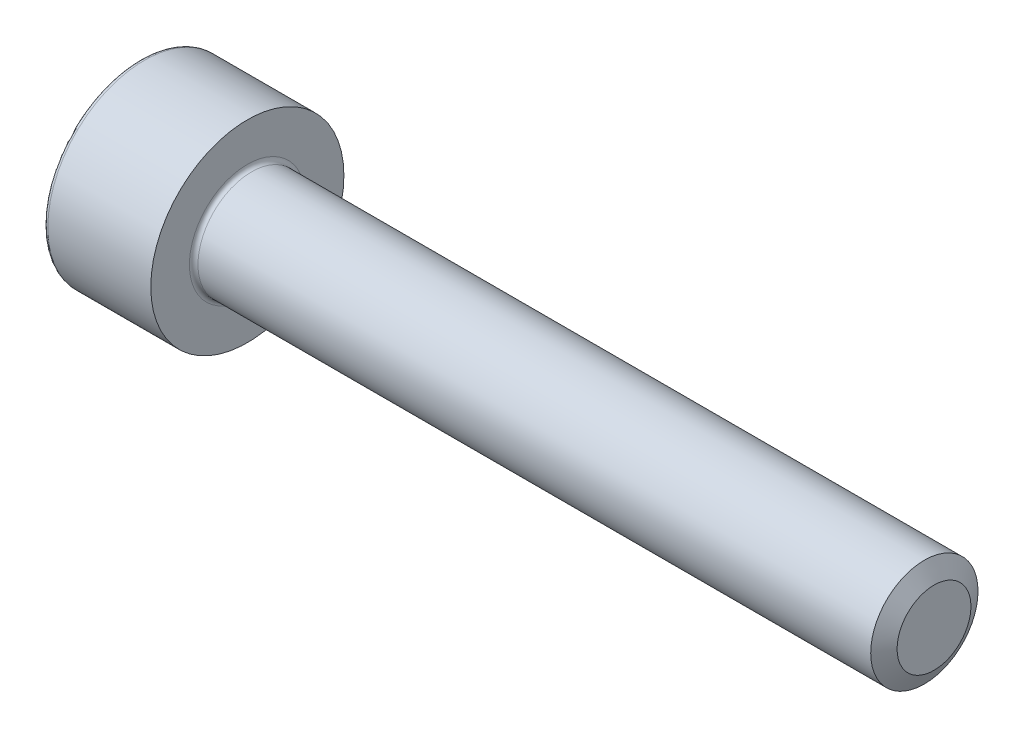
ISO-10303-21;
HEADER;
FILE_DESCRIPTION(('STEP AP214'),'2;1');
FILE_NAME('part.step','',(''),(''),'','','');
FILE_SCHEMA(('AUTOMOTIVE_DESIGN { 1 0 10303 214 1 1 1 1 }'));
ENDSEC;
DATA;
#1=APPLICATION_CONTEXT('core data for automotive mechanical design processes');
#2=APPLICATION_PROTOCOL_DEFINITION('international standard','automotive_design',2000,#1);
#3=PRODUCT_CONTEXT('',#1,'mechanical');
#4=PRODUCT('Part','Part','',(#3));
#5=PRODUCT_RELATED_PRODUCT_CATEGORY('part','',(#4));
#6=PRODUCT_DEFINITION_FORMATION('','',#4);
#7=PRODUCT_DEFINITION_CONTEXT('part definition',#1,'design');
#8=PRODUCT_DEFINITION('design','',#6,#7);
#9=PRODUCT_DEFINITION_SHAPE('','',#8);
#10=(LENGTH_UNIT() NAMED_UNIT(*) SI_UNIT(.MILLI.,.METRE.));
#11=(NAMED_UNIT(*) PLANE_ANGLE_UNIT() SI_UNIT($,.RADIAN.));
#12=(NAMED_UNIT(*) SI_UNIT($,.STERADIAN.) SOLID_ANGLE_UNIT());
#13=UNCERTAINTY_MEASURE_WITH_UNIT(LENGTH_MEASURE(1.E-05),#10,'distance_accuracy_value','');
#14=(GEOMETRIC_REPRESENTATION_CONTEXT(3) GLOBAL_UNCERTAINTY_ASSIGNED_CONTEXT((#13)) GLOBAL_UNIT_ASSIGNED_CONTEXT((#10,
#11,#12)) REPRESENTATION_CONTEXT('',''));
#15=CARTESIAN_POINT('',(0.,0.,0.));
#16=DIRECTION('',(0.,0.,1.));
#17=DIRECTION('',(1.,0.,0.));
#18=AXIS2_PLACEMENT_3D('',#15,#16,#17);
#19=CARTESIAN_POINT('',(0.,0.,0.));
#20=DIRECTION('',(1.,0.,0.));
#21=DIRECTION('',(0.,0.,-1.));
#22=AXIS2_PLACEMENT_3D('',#19,#20,#21);
#23=CYLINDRICAL_SURFACE('',#22,1.25);
#24=CARTESIAN_POINT('',(2.6,0.,0.));
#25=DIRECTION('',(1.,0.,0.));
#26=DIRECTION('',(0.,0.,-1.));
#27=AXIS2_PLACEMENT_3D('',#24,#25,#26);
#28=CIRCLE('',#27,1.25);
#29=CARTESIAN_POINT('',(2.6,0.,-1.25));
#30=VERTEX_POINT('',#29);
#31=EDGE_CURVE('E143',#30,#30,#28,.T.);
#32=ORIENTED_EDGE('',*,*,#31,.T.);
#33=EDGE_LOOP('',(#32));
#34=FACE_BOUND('',#33,.T.);
#35=CARTESIAN_POINT('',(18.275,0.,0.));
#36=DIRECTION('',(-1.,0.,0.));
#37=DIRECTION('',(0.,0.,1.));
#38=AXIS2_PLACEMENT_3D('',#35,#36,#37);
#39=CIRCLE('',#38,1.25);
#40=CARTESIAN_POINT('',(18.275,0.,1.25));
#41=VERTEX_POINT('',#40);
#42=EDGE_CURVE('E313',#41,#41,#39,.T.);
#43=ORIENTED_EDGE('',*,*,#42,.T.);
#44=EDGE_LOOP('',(#43));
#45=FACE_BOUND('',#44,.T.);
#46=ADVANCED_FACE('F40',(#34,#45),#23,.T.);
#47=CARTESIAN_POINT('',(0.,0.,0.));
#48=DIRECTION('',(-1.,0.,0.));
#49=DIRECTION('',(0.,0.,1.));
#50=AXIS2_PLACEMENT_3D('',#47,#48,#49);
#51=PLANE('',#50);
#52=CARTESIAN_POINT('',(0.,0.,0.));
#53=DIRECTION('',(-1.,0.,0.));
#54=DIRECTION('',(0.,0.,1.));
#55=AXIS2_PLACEMENT_3D('',#52,#53,#54);
#56=CIRCLE('',#55,2.15);
#57=CARTESIAN_POINT('',(0.,0.,2.15));
#58=VERTEX_POINT('',#57);
#59=EDGE_CURVE('E11',#58,#58,#56,.T.);
#60=ORIENTED_EDGE('',*,*,#59,.T.);
#61=EDGE_LOOP('',(#60));
#62=FACE_BOUND('',#61,.T.);
#63=DIRECTION('',(0.,0.5,0.866025403784439));
#64=VECTOR('',#63,1.);
#65=CARTESIAN_POINT('',(0.,-1.15,0.));
#66=LINE('',#65,#64);
#67=CARTESIAN_POINT('',(0.,-1.15,0.));
#68=VERTEX_POINT('',#67);
#69=CARTESIAN_POINT('',(0.,-0.575,0.995929214352104));
#70=VERTEX_POINT('',#69);
#71=EDGE_CURVE('E55',#68,#70,#66,.T.);
#72=ORIENTED_EDGE('',*,*,#71,.F.);
#73=DIRECTION('',(0.,-0.5,0.866025403784439));
#74=VECTOR('',#73,1.);
#75=CARTESIAN_POINT('',(0.,-0.575,-0.995929214352104));
#76=LINE('',#75,#74);
#77=CARTESIAN_POINT('',(0.,-0.575,-0.995929214352104));
#78=VERTEX_POINT('',#77);
#79=EDGE_CURVE('E139',#78,#68,#76,.T.);
#80=ORIENTED_EDGE('',*,*,#79,.F.);
#81=DIRECTION('',(0.,-1.,0.));
#82=VECTOR('',#81,1.);
#83=CARTESIAN_POINT('',(0.,0.575,-0.995929214352104));
#84=LINE('',#83,#82);
#85=CARTESIAN_POINT('',(0.,0.575,-0.995929214352104));
#86=VERTEX_POINT('',#85);
#87=EDGE_CURVE('E137',#86,#78,#84,.T.);
#88=ORIENTED_EDGE('',*,*,#87,.F.);
#89=DIRECTION('',(0.,-0.5,-0.866025403784439));
#90=VECTOR('',#89,1.);
#91=CARTESIAN_POINT('',(0.,1.15,0.));
#92=LINE('',#91,#90);
#93=CARTESIAN_POINT('',(0.,1.15,0.));
#94=VERTEX_POINT('',#93);
#95=EDGE_CURVE('E103',#94,#86,#92,.T.);
#96=ORIENTED_EDGE('',*,*,#95,.F.);
#97=DIRECTION('',(0.,0.5,-0.866025403784439));
#98=VECTOR('',#97,1.);
#99=CARTESIAN_POINT('',(0.,0.575,0.995929214352104));
#100=LINE('',#99,#98);
#101=CARTESIAN_POINT('',(0.,0.575,0.995929214352104));
#102=VERTEX_POINT('',#101);
#103=EDGE_CURVE('E133',#102,#94,#100,.T.);
#104=ORIENTED_EDGE('',*,*,#103,.F.);
#105=DIRECTION('',(0.,1.,0.));
#106=VECTOR('',#105,1.);
#107=CARTESIAN_POINT('',(0.,-0.575,0.995929214352104));
#108=LINE('',#107,#106);
#109=EDGE_CURVE('E129',#70,#102,#108,.T.);
#110=ORIENTED_EDGE('',*,*,#109,.F.);
#111=EDGE_LOOP('',(#72,#80,#88,#96,#104,#110));
#112=FACE_BOUND('',#111,.T.);
#113=ADVANCED_FACE('F177',(#62,#112),#51,.T.);
#114=CARTESIAN_POINT('',(0.,0.,0.));
#115=DIRECTION('',(1.,0.,0.));
#116=DIRECTION('',(0.,0.,-1.));
#117=AXIS2_PLACEMENT_3D('',#114,#115,#116);
#118=CYLINDRICAL_SURFACE('',#117,2.25);
#119=CARTESIAN_POINT('',(0.1,0.,0.));
#120=DIRECTION('',(-1.,0.,0.));
#121=DIRECTION('',(0.,0.,1.));
#122=AXIS2_PLACEMENT_3D('',#119,#120,#121);
#123=CIRCLE('',#122,2.25);
#124=CARTESIAN_POINT('',(0.1,0.,2.25));
#125=VERTEX_POINT('',#124);
#126=EDGE_CURVE('E48',#125,#125,#123,.F.);
#127=ORIENTED_EDGE('',*,*,#126,.T.);
#128=EDGE_LOOP('',(#127));
#129=FACE_BOUND('',#128,.T.);
#130=CARTESIAN_POINT('',(2.5,0.,0.));
#131=DIRECTION('',(1.,0.,0.));
#132=DIRECTION('',(0.,0.,-1.));
#133=AXIS2_PLACEMENT_3D('',#130,#131,#132);
#134=CIRCLE('',#133,2.25);
#135=CARTESIAN_POINT('',(2.5,0.,-2.25));
#136=VERTEX_POINT('',#135);
#137=EDGE_CURVE('E154',#136,#136,#134,.T.);
#138=ORIENTED_EDGE('',*,*,#137,.F.);
#139=EDGE_LOOP('',(#138));
#140=FACE_BOUND('',#139,.T.);
#141=ADVANCED_FACE('F160',(#129,#140),#118,.T.);
#142=CARTESIAN_POINT('',(2.5,2.25,0.));
#143=DIRECTION('',(1.,0.,0.));
#144=DIRECTION('',(0.,0.,-1.));
#145=AXIS2_PLACEMENT_3D('',#142,#143,#144);
#146=PLANE('',#145);
#147=ORIENTED_EDGE('',*,*,#137,.T.);
#148=EDGE_LOOP('',(#147));
#149=FACE_BOUND('',#148,.T.);
#150=CARTESIAN_POINT('',(2.5,0.,0.));
#151=DIRECTION('',(1.,0.,0.));
#152=DIRECTION('',(0.,0.,-1.));
#153=AXIS2_PLACEMENT_3D('',#150,#151,#152);
#154=CIRCLE('',#153,1.35);
#155=CARTESIAN_POINT('',(2.5,0.,-1.35));
#156=VERTEX_POINT('',#155);
#157=EDGE_CURVE('E151',#156,#156,#154,.T.);
#158=ORIENTED_EDGE('',*,*,#157,.F.);
#159=EDGE_LOOP('',(#158));
#160=FACE_BOUND('',#159,.T.);
#161=ADVANCED_FACE('F192',(#149,#160),#146,.T.);
#162=CARTESIAN_POINT('',(2.6,0.,0.));
#163=DIRECTION('',(1.,0.,0.));
#164=DIRECTION('',(0.,0.,-1.));
#165=AXIS2_PLACEMENT_3D('',#162,#163,#164);
#166=TOROIDAL_SURFACE('',#165,1.35,0.0999999999999997);
#167=ORIENTED_EDGE('',*,*,#157,.T.);
#168=EDGE_LOOP('',(#167));
#169=FACE_BOUND('',#168,.T.);
#170=ORIENTED_EDGE('',*,*,#31,.F.);
#171=EDGE_LOOP('',(#170));
#172=FACE_BOUND('',#171,.T.);
#173=ADVANCED_FACE('F188',(#169,#172),#166,.F.);
#174=CARTESIAN_POINT('',(1.1,-1.15,0.));
#175=DIRECTION('',(0.,-0.866025403784439,0.5));
#176=DIRECTION('',(0.,-0.5,-0.866025403784439));
#177=AXIS2_PLACEMENT_3D('',#174,#175,#176);
#178=PLANE('',#177);
#179=ORIENTED_EDGE('',*,*,#71,.T.);
#180=DIRECTION('',(-1.,0.,0.));
#181=VECTOR('',#180,1.);
#182=CARTESIAN_POINT('',(1.1,-0.575,0.995929214352104));
#183=LINE('',#182,#181);
#184=CARTESIAN_POINT('',(1.1,-0.575,0.995929214352104));
#185=VERTEX_POINT('',#184);
#186=EDGE_CURVE('E85',#185,#70,#183,.T.);
#187=ORIENTED_EDGE('',*,*,#186,.F.);
#188=DIRECTION('',(0.,0.5,0.866025403784439));
#189=VECTOR('',#188,1.);
#190=CARTESIAN_POINT('',(1.1,-1.15,0.));
#191=LINE('',#190,#189);
#192=CARTESIAN_POINT('',(1.1,-1.15,0.));
#193=VERTEX_POINT('',#192);
#194=EDGE_CURVE('E141',#193,#185,#191,.T.);
#195=ORIENTED_EDGE('',*,*,#194,.F.);
#196=DIRECTION('',(-1.,0.,0.));
#197=VECTOR('',#196,1.);
#198=CARTESIAN_POINT('',(1.1,-1.15,0.));
#199=LINE('',#198,#197);
#200=EDGE_CURVE('E63',#193,#68,#199,.T.);
#201=ORIENTED_EDGE('',*,*,#200,.T.);
#202=EDGE_LOOP('',(#179,#187,#195,#201));
#203=FACE_BOUND('',#202,.T.);
#204=ADVANCED_FACE('F191',(#203),#178,.F.);
#205=CARTESIAN_POINT('',(1.1,-0.575,-0.995929214352104));
#206=DIRECTION('',(0.,-0.866025403784439,-0.5));
#207=DIRECTION('',(0.,0.5,-0.866025403784439));
#208=AXIS2_PLACEMENT_3D('',#205,#206,#207);
#209=PLANE('',#208);
#210=ORIENTED_EDGE('',*,*,#79,.T.);
#211=ORIENTED_EDGE('',*,*,#200,.F.);
#212=DIRECTION('',(0.,-0.5,0.866025403784439));
#213=VECTOR('',#212,1.);
#214=CARTESIAN_POINT('',(1.1,-0.575,-0.995929214352104));
#215=LINE('',#214,#213);
#216=CARTESIAN_POINT('',(1.1,-0.575,-0.995929214352104));
#217=VERTEX_POINT('',#216);
#218=EDGE_CURVE('E115',#217,#193,#215,.T.);
#219=ORIENTED_EDGE('',*,*,#218,.F.);
#220=DIRECTION('',(-1.,0.,0.));
#221=VECTOR('',#220,1.);
#222=CARTESIAN_POINT('',(1.1,-0.575,-0.995929214352104));
#223=LINE('',#222,#221);
#224=EDGE_CURVE('E107',#217,#78,#223,.T.);
#225=ORIENTED_EDGE('',*,*,#224,.T.);
#226=EDGE_LOOP('',(#210,#211,#219,#225));
#227=FACE_BOUND('',#226,.T.);
#228=ADVANCED_FACE('F217',(#227),#209,.F.);
#229=CARTESIAN_POINT('',(1.1,0.575,-0.995929214352104));
#230=DIRECTION('',(0.,0.,-1.));
#231=DIRECTION('',(-1.,0.,0.));
#232=AXIS2_PLACEMENT_3D('',#229,#230,#231);
#233=PLANE('',#232);
#234=ORIENTED_EDGE('',*,*,#87,.T.);
#235=ORIENTED_EDGE('',*,*,#224,.F.);
#236=DIRECTION('',(0.,-1.,0.));
#237=VECTOR('',#236,1.);
#238=CARTESIAN_POINT('',(1.1,0.575,-0.995929214352104));
#239=LINE('',#238,#237);
#240=CARTESIAN_POINT('',(1.1,0.575,-0.995929214352104));
#241=VERTEX_POINT('',#240);
#242=EDGE_CURVE('E111',#241,#217,#239,.T.);
#243=ORIENTED_EDGE('',*,*,#242,.F.);
#244=DIRECTION('',(-1.,0.,0.));
#245=VECTOR('',#244,1.);
#246=CARTESIAN_POINT('',(1.1,0.575,-0.995929214352104));
#247=LINE('',#246,#245);
#248=EDGE_CURVE('E96',#241,#86,#247,.T.);
#249=ORIENTED_EDGE('',*,*,#248,.T.);
#250=EDGE_LOOP('',(#234,#235,#243,#249));
#251=FACE_BOUND('',#250,.T.);
#252=ADVANCED_FACE('F112',(#251),#233,.F.);
#253=CARTESIAN_POINT('',(1.1,1.15,0.));
#254=DIRECTION('',(0.,0.866025403784439,-0.5));
#255=DIRECTION('',(0.,0.5,0.866025403784439));
#256=AXIS2_PLACEMENT_3D('',#253,#254,#255);
#257=PLANE('',#256);
#258=ORIENTED_EDGE('',*,*,#95,.T.);
#259=ORIENTED_EDGE('',*,*,#248,.F.);
#260=DIRECTION('',(0.,-0.5,-0.866025403784439));
#261=VECTOR('',#260,1.);
#262=CARTESIAN_POINT('',(1.1,1.15,0.));
#263=LINE('',#262,#261);
#264=CARTESIAN_POINT('',(1.1,1.15,0.));
#265=VERTEX_POINT('',#264);
#266=EDGE_CURVE('E100',#265,#241,#263,.T.);
#267=ORIENTED_EDGE('',*,*,#266,.F.);
#268=DIRECTION('',(-1.,0.,0.));
#269=VECTOR('',#268,1.);
#270=CARTESIAN_POINT('',(1.1,1.15,0.));
#271=LINE('',#270,#269);
#272=EDGE_CURVE('E108',#265,#94,#271,.T.);
#273=ORIENTED_EDGE('',*,*,#272,.T.);
#274=EDGE_LOOP('',(#258,#259,#267,#273));
#275=FACE_BOUND('',#274,.T.);
#276=ADVANCED_FACE('F98',(#275),#257,.F.);
#277=CARTESIAN_POINT('',(1.1,0.575,0.995929214352104));
#278=DIRECTION('',(0.,0.866025403784439,0.5));
#279=DIRECTION('',(0.,-0.5,0.866025403784439));
#280=AXIS2_PLACEMENT_3D('',#277,#278,#279);
#281=PLANE('',#280);
#282=ORIENTED_EDGE('',*,*,#103,.T.);
#283=ORIENTED_EDGE('',*,*,#272,.F.);
#284=DIRECTION('',(0.,0.5,-0.866025403784439));
#285=VECTOR('',#284,1.);
#286=CARTESIAN_POINT('',(1.1,0.575,0.995929214352104));
#287=LINE('',#286,#285);
#288=CARTESIAN_POINT('',(1.1,0.575,0.995929214352104));
#289=VERTEX_POINT('',#288);
#290=EDGE_CURVE('E121',#289,#265,#287,.T.);
#291=ORIENTED_EDGE('',*,*,#290,.F.);
#292=DIRECTION('',(-1.,0.,0.));
#293=VECTOR('',#292,1.);
#294=CARTESIAN_POINT('',(1.1,0.575,0.995929214352104));
#295=LINE('',#294,#293);
#296=EDGE_CURVE('E146',#289,#102,#295,.T.);
#297=ORIENTED_EDGE('',*,*,#296,.T.);
#298=EDGE_LOOP('',(#282,#283,#291,#297));
#299=FACE_BOUND('',#298,.T.);
#300=ADVANCED_FACE('F235',(#299),#281,.F.);
#301=CARTESIAN_POINT('',(1.1,-0.575,0.995929214352104));
#302=DIRECTION('',(0.,0.,1.));
#303=DIRECTION('',(0.,-1.,0.));
#304=AXIS2_PLACEMENT_3D('',#301,#302,#303);
#305=PLANE('',#304);
#306=ORIENTED_EDGE('',*,*,#109,.T.);
#307=ORIENTED_EDGE('',*,*,#296,.F.);
#308=DIRECTION('',(0.,1.,0.));
#309=VECTOR('',#308,1.);
#310=CARTESIAN_POINT('',(1.1,-0.575,0.995929214352104));
#311=LINE('',#310,#309);
#312=EDGE_CURVE('E123',#185,#289,#311,.T.);
#313=ORIENTED_EDGE('',*,*,#312,.F.);
#314=ORIENTED_EDGE('',*,*,#186,.T.);
#315=EDGE_LOOP('',(#306,#307,#313,#314));
#316=FACE_BOUND('',#315,.T.);
#317=ADVANCED_FACE('F173',(#316),#305,.F.);
#318=CARTESIAN_POINT('',(1.1,-0.575,0.995929214352104));
#319=DIRECTION('',(-1.,0.,0.));
#320=DIRECTION('',(0.,0.,1.));
#321=AXIS2_PLACEMENT_3D('',#318,#319,#320);
#322=PLANE('',#321);
#323=ORIENTED_EDGE('',*,*,#194,.T.);
#324=ORIENTED_EDGE('',*,*,#312,.T.);
#325=ORIENTED_EDGE('',*,*,#290,.T.);
#326=ORIENTED_EDGE('',*,*,#266,.T.);
#327=ORIENTED_EDGE('',*,*,#242,.T.);
#328=ORIENTED_EDGE('',*,*,#218,.T.);
#329=EDGE_LOOP('',(#323,#324,#325,#326,#327,#328));
#330=FACE_BOUND('',#329,.T.);
#331=ADVANCED_FACE('F118',(#330),#322,.T.);
#332=CARTESIAN_POINT('',(0.1,0.,0.));
#333=DIRECTION('',(-1.,0.,0.));
#334=DIRECTION('',(0.,0.,1.));
#335=AXIS2_PLACEMENT_3D('',#332,#333,#334);
#336=TOROIDAL_SURFACE('',#335,2.15,0.1);
#337=ORIENTED_EDGE('',*,*,#59,.F.);
#338=EDGE_LOOP('',(#337));
#339=FACE_BOUND('',#338,.T.);
#340=ORIENTED_EDGE('',*,*,#126,.F.);
#341=EDGE_LOOP('',(#340));
#342=FACE_BOUND('',#341,.T.);
#343=ADVANCED_FACE('F42',(#339,#342),#336,.T.);
#344=CARTESIAN_POINT('',(18.275,0.,0.));
#345=DIRECTION('',(-1.,0.,0.));
#346=DIRECTION('',(0.,0.,1.));
#347=AXIS2_PLACEMENT_3D('',#344,#345,#346);
#348=CONICAL_SURFACE('',#347,1.25,1.04718484902493);
#349=CARTESIAN_POINT('',(18.5,0.,0.));
#350=DIRECTION('',(-1.,0.,0.));
#351=DIRECTION('',(0.,0.,1.));
#352=AXIS2_PLACEMENT_3D('',#349,#350,#351);
#353=CIRCLE('',#352,0.8603);
#354=CARTESIAN_POINT('',(18.5,0.,0.8603));
#355=VERTEX_POINT('',#354);
#356=EDGE_CURVE('E130',#355,#355,#353,.T.);
#357=ORIENTED_EDGE('',*,*,#356,.T.);
#358=EDGE_LOOP('',(#357));
#359=FACE_BOUND('',#358,.T.);
#360=ORIENTED_EDGE('',*,*,#42,.F.);
#361=EDGE_LOOP('',(#360));
#362=FACE_BOUND('',#361,.T.);
#363=ADVANCED_FACE('F164',(#359,#362),#348,.T.);
#364=CARTESIAN_POINT('',(18.5,1.25,0.));
#365=DIRECTION('',(1.,0.,0.));
#366=DIRECTION('',(0.,0.,-1.));
#367=AXIS2_PLACEMENT_3D('',#364,#365,#366);
#368=PLANE('',#367);
#369=ORIENTED_EDGE('',*,*,#356,.F.);
#370=EDGE_LOOP('',(#369));
#371=FACE_BOUND('',#370,.T.);
#372=ADVANCED_FACE('F170',(#371),#368,.T.);
#373=CLOSED_SHELL('',(#46,#113,#141,#161,#173,#204,#228,#252,#276,#300,#317,#331,#343,#363,#372));
#374=MANIFOLD_SOLID_BREP('B2',#373);
#375=ADVANCED_BREP_SHAPE_REPRESENTATION('',(#18,#374),#14);
#376=SHAPE_DEFINITION_REPRESENTATION(#9,#375);
ENDSEC;
END-ISO-10303-21;
